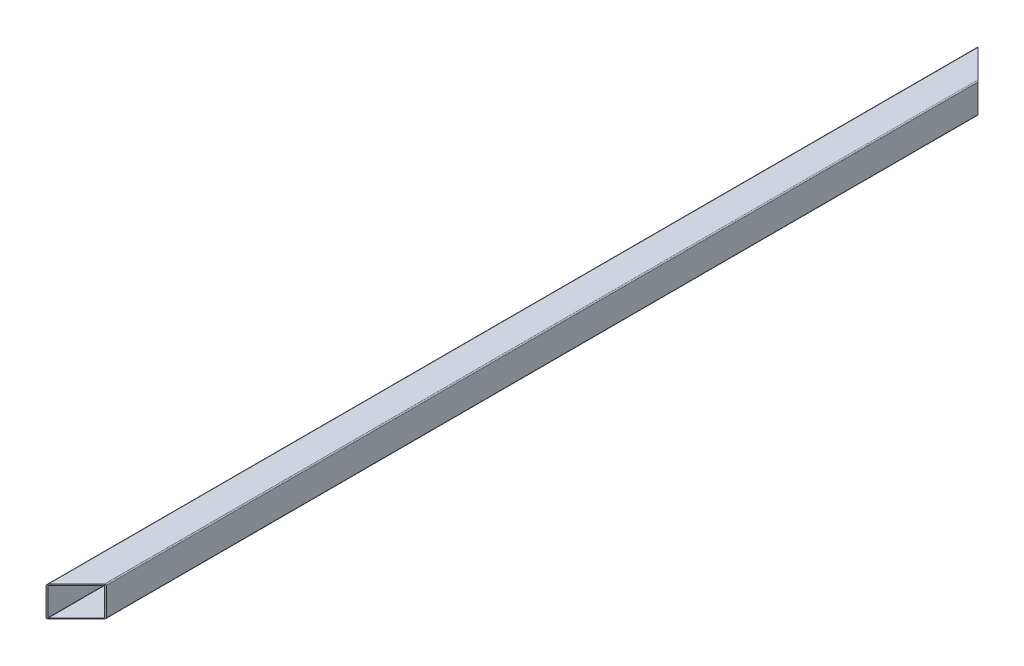
ISO-10303-21;
HEADER;
FILE_DESCRIPTION(('STEP AP214'),'2;1');
FILE_NAME('part.step','',(''),(''),'','','');
FILE_SCHEMA(('AUTOMOTIVE_DESIGN { 1 0 10303 214 1 1 1 1 }'));
ENDSEC;
DATA;
#1=APPLICATION_CONTEXT('core data for automotive mechanical design processes');
#2=APPLICATION_PROTOCOL_DEFINITION('international standard','automotive_design',2000,#1);
#3=PRODUCT_CONTEXT('',#1,'mechanical');
#4=PRODUCT('Part','Part','',(#3));
#5=PRODUCT_RELATED_PRODUCT_CATEGORY('part','',(#4));
#6=PRODUCT_DEFINITION_FORMATION('','',#4);
#7=PRODUCT_DEFINITION_CONTEXT('part definition',#1,'design');
#8=PRODUCT_DEFINITION('design','',#6,#7);
#9=PRODUCT_DEFINITION_SHAPE('','',#8);
#10=(LENGTH_UNIT() NAMED_UNIT(*) SI_UNIT(.MILLI.,.METRE.));
#11=(NAMED_UNIT(*) PLANE_ANGLE_UNIT() SI_UNIT($,.RADIAN.));
#12=(NAMED_UNIT(*) SI_UNIT($,.STERADIAN.) SOLID_ANGLE_UNIT());
#13=UNCERTAINTY_MEASURE_WITH_UNIT(LENGTH_MEASURE(1.E-05),#10,'distance_accuracy_value','');
#14=(GEOMETRIC_REPRESENTATION_CONTEXT(3) GLOBAL_UNCERTAINTY_ASSIGNED_CONTEXT((#13)) GLOBAL_UNIT_ASSIGNED_CONTEXT((#10,
#11,#12)) REPRESENTATION_CONTEXT('',''));
#15=CARTESIAN_POINT('',(0.,0.,0.));
#16=DIRECTION('',(0.,0.,1.));
#17=DIRECTION('',(1.,0.,0.));
#18=AXIS2_PLACEMENT_3D('',#15,#16,#17);
#19=CARTESIAN_POINT('',(-18.5,18.5,-1236.));
#20=DIRECTION('',(0.,0.,1.));
#21=DIRECTION('',(1.,0.,0.));
#22=AXIS2_PLACEMENT_3D('',#19,#20,#21);
#23=CYLINDRICAL_SURFACE('',#22,1.5);
#24=DIRECTION('',(0.,0.,1.));
#25=VECTOR('',#24,1.);
#26=CARTESIAN_POINT('',(-20.,18.5,-1236.));
#27=LINE('',#26,#25);
#28=CARTESIAN_POINT('',(-20.,18.5,-1236.));
#29=VERTEX_POINT('',#28);
#30=CARTESIAN_POINT('',(-20.,18.5,0.));
#31=VERTEX_POINT('',#30);
#32=EDGE_CURVE('E227',#29,#31,#27,.T.);
#33=ORIENTED_EDGE('',*,*,#32,.T.);
#34=CARTESIAN_POINT('',(-18.5,18.5,-1.50000000000006));
#35=DIRECTION('',(-0.707106781186549,0.,-0.707106781186546));
#36=DIRECTION('',(-0.707106781186546,0.,0.707106781186549));
#37=AXIS2_PLACEMENT_3D('',#34,#35,#36);
#38=ELLIPSE('',#37,2.12132034355964,1.5);
#39=CARTESIAN_POINT('',(-18.5,20.,-1.5));
#40=VERTEX_POINT('',#39);
#41=EDGE_CURVE('E184',#31,#40,#38,.T.);
#42=ORIENTED_EDGE('',*,*,#41,.T.);
#43=DIRECTION('',(0.,0.,1.));
#44=VECTOR('',#43,1.);
#45=CARTESIAN_POINT('',(-18.5,20.,-1236.));
#46=LINE('',#45,#44);
#47=CARTESIAN_POINT('',(-18.5,20.,-1234.5));
#48=VERTEX_POINT('',#47);
#49=EDGE_CURVE('E12',#48,#40,#46,.T.);
#50=ORIENTED_EDGE('',*,*,#49,.F.);
#51=CARTESIAN_POINT('',(-18.5,18.5,-1234.5));
#52=DIRECTION('',(-0.707106781186549,0.,0.707106781186546));
#53=DIRECTION('',(0.707106781186546,0.,0.707106781186549));
#54=AXIS2_PLACEMENT_3D('',#51,#52,#53);
#55=ELLIPSE('',#54,2.12132034355964,1.5);
#56=EDGE_CURVE('E294',#48,#29,#55,.T.);
#57=ORIENTED_EDGE('',*,*,#56,.T.);
#58=EDGE_LOOP('',(#33,#42,#50,#57));
#59=FACE_BOUND('',#58,.T.);
#60=ADVANCED_FACE('F59',(#59),#23,.T.);
#61=CARTESIAN_POINT('',(-18.5,20.,-1236.));
#62=DIRECTION('',(0.,-1.,0.));
#63=DIRECTION('',(0.,0.,-1.));
#64=AXIS2_PLACEMENT_3D('',#61,#62,#63);
#65=PLANE('',#64);
#66=ORIENTED_EDGE('',*,*,#49,.T.);
#67=DIRECTION('',(-0.707106781186546,0.,0.707106781186549));
#68=VECTOR('',#67,1.);
#69=CARTESIAN_POINT('',(-20.,20.,0.));
#70=LINE('',#69,#68);
#71=CARTESIAN_POINT('',(18.5,20.,-38.5000000000002));
#72=VERTEX_POINT('',#71);
#73=EDGE_CURVE('E176',#72,#40,#70,.T.);
#74=ORIENTED_EDGE('',*,*,#73,.F.);
#75=DIRECTION('',(0.,0.,1.));
#76=VECTOR('',#75,1.);
#77=CARTESIAN_POINT('',(18.5,20.,-1236.));
#78=LINE('',#77,#76);
#79=CARTESIAN_POINT('',(18.5,20.,-1197.5));
#80=VERTEX_POINT('',#79);
#81=EDGE_CURVE('E68',#80,#72,#78,.T.);
#82=ORIENTED_EDGE('',*,*,#81,.F.);
#83=DIRECTION('',(0.707106781186546,0.,0.707106781186549));
#84=VECTOR('',#83,1.);
#85=CARTESIAN_POINT('',(-20.,20.,-1236.));
#86=LINE('',#85,#84);
#87=EDGE_CURVE('E268',#48,#80,#86,.T.);
#88=ORIENTED_EDGE('',*,*,#87,.F.);
#89=EDGE_LOOP('',(#66,#74,#82,#88));
#90=FACE_BOUND('',#89,.T.);
#91=ADVANCED_FACE('F188',(#90),#65,.F.);
#92=CARTESIAN_POINT('',(18.5,18.5,-1236.));
#93=DIRECTION('',(0.,0.,1.));
#94=DIRECTION('',(1.,0.,0.));
#95=AXIS2_PLACEMENT_3D('',#92,#93,#94);
#96=CYLINDRICAL_SURFACE('',#95,1.5);
#97=ORIENTED_EDGE('',*,*,#81,.T.);
#98=CARTESIAN_POINT('',(18.5,18.5,-38.5000000000002));
#99=DIRECTION('',(-0.707106781186549,0.,-0.707106781186546));
#100=DIRECTION('',(-0.707106781186546,0.,0.707106781186549));
#101=AXIS2_PLACEMENT_3D('',#98,#99,#100);
#102=ELLIPSE('',#101,2.12132034355964,1.5);
#103=CARTESIAN_POINT('',(20.,18.5,-40.0000000000003));
#104=VERTEX_POINT('',#103);
#105=EDGE_CURVE('E173',#72,#104,#102,.T.);
#106=ORIENTED_EDGE('',*,*,#105,.T.);
#107=DIRECTION('',(0.,0.,1.));
#108=VECTOR('',#107,1.);
#109=CARTESIAN_POINT('',(20.,18.5,-1236.));
#110=LINE('',#109,#108);
#111=CARTESIAN_POINT('',(20.,18.5,-1196.));
#112=VERTEX_POINT('',#111);
#113=EDGE_CURVE('E196',#112,#104,#110,.T.);
#114=ORIENTED_EDGE('',*,*,#113,.F.);
#115=CARTESIAN_POINT('',(18.5,18.5,-1197.5));
#116=DIRECTION('',(-0.707106781186549,0.,0.707106781186546));
#117=DIRECTION('',(0.707106781186546,0.,0.707106781186549));
#118=AXIS2_PLACEMENT_3D('',#115,#116,#117);
#119=ELLIPSE('',#118,2.12132034355964,1.5);
#120=EDGE_CURVE('E195',#112,#80,#119,.T.);
#121=ORIENTED_EDGE('',*,*,#120,.T.);
#122=EDGE_LOOP('',(#97,#106,#114,#121));
#123=FACE_BOUND('',#122,.T.);
#124=ADVANCED_FACE('F194',(#123),#96,.T.);
#125=CARTESIAN_POINT('',(20.,-18.5,-1236.));
#126=DIRECTION('',(-1.,0.,0.));
#127=DIRECTION('',(0.,0.,1.));
#128=AXIS2_PLACEMENT_3D('',#125,#126,#127);
#129=PLANE('',#128);
#130=ORIENTED_EDGE('',*,*,#113,.T.);
#131=DIRECTION('',(0.,-1.,0.));
#132=VECTOR('',#131,1.);
#133=CARTESIAN_POINT('',(20.,-18.5,-40.0000000000003));
#134=LINE('',#133,#132);
#135=CARTESIAN_POINT('',(20.,-18.5,-40.0000000000003));
#136=VERTEX_POINT('',#135);
#137=EDGE_CURVE('E179',#104,#136,#134,.T.);
#138=ORIENTED_EDGE('',*,*,#137,.T.);
#139=DIRECTION('',(0.,0.,1.));
#140=VECTOR('',#139,1.);
#141=CARTESIAN_POINT('',(20.,-18.5,-1236.));
#142=LINE('',#141,#140);
#143=CARTESIAN_POINT('',(20.,-18.5,-1196.));
#144=VERTEX_POINT('',#143);
#145=EDGE_CURVE('E198',#144,#136,#142,.T.);
#146=ORIENTED_EDGE('',*,*,#145,.F.);
#147=DIRECTION('',(0.,1.,0.));
#148=VECTOR('',#147,1.);
#149=CARTESIAN_POINT('',(20.,-18.5,-1196.));
#150=LINE('',#149,#148);
#151=EDGE_CURVE('E261',#144,#112,#150,.T.);
#152=ORIENTED_EDGE('',*,*,#151,.T.);
#153=EDGE_LOOP('',(#130,#138,#146,#152));
#154=FACE_BOUND('',#153,.T.);
#155=ADVANCED_FACE('F260',(#154),#129,.F.);
#156=CARTESIAN_POINT('',(18.5,-18.5,-1236.));
#157=DIRECTION('',(0.,0.,1.));
#158=DIRECTION('',(1.,0.,0.));
#159=AXIS2_PLACEMENT_3D('',#156,#157,#158);
#160=CYLINDRICAL_SURFACE('',#159,1.5);
#161=ORIENTED_EDGE('',*,*,#145,.T.);
#162=CARTESIAN_POINT('',(18.5,-18.5,-38.5000000000002));
#163=DIRECTION('',(-0.707106781186549,0.,-0.707106781186546));
#164=DIRECTION('',(-0.707106781186546,0.,0.707106781186549));
#165=AXIS2_PLACEMENT_3D('',#162,#163,#164);
#166=ELLIPSE('',#165,2.12132034355965,1.5);
#167=CARTESIAN_POINT('',(18.5000000000001,-20.,-38.5000000000003));
#168=VERTEX_POINT('',#167);
#169=EDGE_CURVE('E256',#136,#168,#166,.T.);
#170=ORIENTED_EDGE('',*,*,#169,.T.);
#171=DIRECTION('',(0.,0.,1.));
#172=VECTOR('',#171,1.);
#173=CARTESIAN_POINT('',(18.5,-20.,-1236.));
#174=LINE('',#173,#172);
#175=CARTESIAN_POINT('',(18.5,-20.,-1197.5));
#176=VERTEX_POINT('',#175);
#177=EDGE_CURVE('E247',#176,#168,#174,.T.);
#178=ORIENTED_EDGE('',*,*,#177,.F.);
#179=CARTESIAN_POINT('',(18.5,-18.5,-1197.5));
#180=DIRECTION('',(-0.707106781186549,0.,0.707106781186546));
#181=DIRECTION('',(0.707106781186546,0.,0.707106781186549));
#182=AXIS2_PLACEMENT_3D('',#179,#180,#181);
#183=ELLIPSE('',#182,2.12132034355965,1.5);
#184=EDGE_CURVE('E257',#176,#144,#183,.T.);
#185=ORIENTED_EDGE('',*,*,#184,.T.);
#186=EDGE_LOOP('',(#161,#170,#178,#185));
#187=FACE_BOUND('',#186,.T.);
#188=ADVANCED_FACE('F254',(#187),#160,.T.);
#189=CARTESIAN_POINT('',(18.5,-20.,-1236.));
#190=DIRECTION('',(0.,1.,0.));
#191=DIRECTION('',(0.,0.,1.));
#192=AXIS2_PLACEMENT_3D('',#189,#190,#191);
#193=PLANE('',#192);
#194=ORIENTED_EDGE('',*,*,#177,.T.);
#195=DIRECTION('',(-0.707106781186546,0.,0.707106781186549));
#196=VECTOR('',#195,1.);
#197=CARTESIAN_POINT('',(617.25,-20.,-637.250000000003));
#198=LINE('',#197,#196);
#199=CARTESIAN_POINT('',(-18.5,-20.,-1.50000000000006));
#200=VERTEX_POINT('',#199);
#201=EDGE_CURVE('E263',#168,#200,#198,.T.);
#202=ORIENTED_EDGE('',*,*,#201,.T.);
#203=DIRECTION('',(0.,0.,1.));
#204=VECTOR('',#203,1.);
#205=CARTESIAN_POINT('',(-18.5,-20.,-1236.));
#206=LINE('',#205,#204);
#207=CARTESIAN_POINT('',(-18.5,-20.,-1234.5));
#208=VERTEX_POINT('',#207);
#209=EDGE_CURVE('E239',#208,#200,#206,.T.);
#210=ORIENTED_EDGE('',*,*,#209,.F.);
#211=DIRECTION('',(0.707106781186546,0.,0.707106781186549));
#212=VECTOR('',#211,1.);
#213=CARTESIAN_POINT('',(-0.750000000000098,-20.,-1216.75));
#214=LINE('',#213,#212);
#215=EDGE_CURVE('E288',#208,#176,#214,.T.);
#216=ORIENTED_EDGE('',*,*,#215,.T.);
#217=EDGE_LOOP('',(#194,#202,#210,#216));
#218=FACE_BOUND('',#217,.T.);
#219=ADVANCED_FACE('F341',(#218),#193,.F.);
#220=CARTESIAN_POINT('',(-18.5,-18.5,-1236.));
#221=DIRECTION('',(0.,0.,1.));
#222=DIRECTION('',(1.,0.,0.));
#223=AXIS2_PLACEMENT_3D('',#220,#221,#222);
#224=CYLINDRICAL_SURFACE('',#223,1.5);
#225=ORIENTED_EDGE('',*,*,#209,.T.);
#226=CARTESIAN_POINT('',(-18.5,-18.5,-1.50000000000006));
#227=DIRECTION('',(-0.707106781186549,0.,-0.707106781186546));
#228=DIRECTION('',(-0.707106781186546,0.,0.707106781186549));
#229=AXIS2_PLACEMENT_3D('',#226,#227,#228);
#230=ELLIPSE('',#229,2.12132034355965,1.5);
#231=CARTESIAN_POINT('',(-20.,-18.5,0.));
#232=VERTEX_POINT('',#231);
#233=EDGE_CURVE('E302',#200,#232,#230,.T.);
#234=ORIENTED_EDGE('',*,*,#233,.T.);
#235=DIRECTION('',(0.,0.,1.));
#236=VECTOR('',#235,1.);
#237=CARTESIAN_POINT('',(-20.,-18.5,-1236.));
#238=LINE('',#237,#236);
#239=CARTESIAN_POINT('',(-20.,-18.5,-1236.));
#240=VERTEX_POINT('',#239);
#241=EDGE_CURVE('E233',#240,#232,#238,.T.);
#242=ORIENTED_EDGE('',*,*,#241,.F.);
#243=CARTESIAN_POINT('',(-18.5,-18.5,-1234.5));
#244=DIRECTION('',(-0.707106781186549,0.,0.707106781186546));
#245=DIRECTION('',(0.707106781186546,0.,0.707106781186549));
#246=AXIS2_PLACEMENT_3D('',#243,#244,#245);
#247=ELLIPSE('',#246,2.12132034355965,1.5);
#248=EDGE_CURVE('E285',#240,#208,#247,.T.);
#249=ORIENTED_EDGE('',*,*,#248,.T.);
#250=EDGE_LOOP('',(#225,#234,#242,#249));
#251=FACE_BOUND('',#250,.T.);
#252=ADVANCED_FACE('F305',(#251),#224,.T.);
#253=CARTESIAN_POINT('',(18.5,18.5,-1236.));
#254=DIRECTION('',(0.,0.,1.));
#255=DIRECTION('',(1.,0.,0.));
#256=AXIS2_PLACEMENT_3D('',#253,#254,#255);
#257=CYLINDRICAL_SURFACE('',#256,0.3);
#258=CARTESIAN_POINT('',(18.5,18.5,-38.5000000000002));
#259=DIRECTION('',(-0.707106781186549,0.,-0.707106781186546));
#260=DIRECTION('',(-0.707106781186546,0.,0.707106781186549));
#261=AXIS2_PLACEMENT_3D('',#258,#259,#260);
#262=ELLIPSE('',#261,0.42426406871193,0.3);
#263=CARTESIAN_POINT('',(18.5000000000001,18.8,-38.5000000000003));
#264=VERTEX_POINT('',#263);
#265=CARTESIAN_POINT('',(18.8,18.5,-38.8000000000004));
#266=VERTEX_POINT('',#265);
#267=EDGE_CURVE('E76',#264,#266,#262,.T.);
#268=ORIENTED_EDGE('',*,*,#267,.F.);
#269=DIRECTION('',(0.,0.,1.));
#270=VECTOR('',#269,1.);
#271=CARTESIAN_POINT('',(18.5,18.8,-1236.));
#272=LINE('',#271,#270);
#273=CARTESIAN_POINT('',(18.5,18.8,-1197.5));
#274=VERTEX_POINT('',#273);
#275=EDGE_CURVE('E63',#274,#264,#272,.T.);
#276=ORIENTED_EDGE('',*,*,#275,.F.);
#277=CARTESIAN_POINT('',(18.5,18.5,-1197.5));
#278=DIRECTION('',(-0.707106781186549,0.,0.707106781186546));
#279=DIRECTION('',(0.707106781186546,0.,0.707106781186549));
#280=AXIS2_PLACEMENT_3D('',#277,#278,#279);
#281=ELLIPSE('',#280,0.42426406871193,0.3);
#282=CARTESIAN_POINT('',(18.8,18.5,-1197.2));
#283=VERTEX_POINT('',#282);
#284=EDGE_CURVE('E283',#283,#274,#281,.T.);
#285=ORIENTED_EDGE('',*,*,#284,.F.);
#286=DIRECTION('',(0.,0.,1.));
#287=VECTOR('',#286,1.);
#288=CARTESIAN_POINT('',(18.8,18.5,-1236.));
#289=LINE('',#288,#287);
#290=EDGE_CURVE('E202',#283,#266,#289,.T.);
#291=ORIENTED_EDGE('',*,*,#290,.T.);
#292=EDGE_LOOP('',(#268,#276,#285,#291));
#293=FACE_BOUND('',#292,.T.);
#294=ADVANCED_FACE('F61',(#293),#257,.F.);
#295=CARTESIAN_POINT('',(-18.5,18.8,-1236.));
#296=DIRECTION('',(0.,-1.,0.));
#297=DIRECTION('',(0.,0.,-1.));
#298=AXIS2_PLACEMENT_3D('',#295,#296,#297);
#299=PLANE('',#298);
#300=DIRECTION('',(0.707106781186546,0.,-0.707106781186549));
#301=VECTOR('',#300,1.);
#302=CARTESIAN_POINT('',(598.75,18.8,-618.750000000003));
#303=LINE('',#302,#301);
#304=CARTESIAN_POINT('',(-18.5,18.8,-1.50000000000006));
#305=VERTEX_POINT('',#304);
#306=EDGE_CURVE('E308',#305,#264,#303,.T.);
#307=ORIENTED_EDGE('',*,*,#306,.F.);
#308=DIRECTION('',(0.,0.,1.));
#309=VECTOR('',#308,1.);
#310=CARTESIAN_POINT('',(-18.5,18.8,-1236.));
#311=LINE('',#310,#309);
#312=CARTESIAN_POINT('',(-18.5,18.8,-1234.5));
#313=VERTEX_POINT('',#312);
#314=EDGE_CURVE('E220',#313,#305,#311,.T.);
#315=ORIENTED_EDGE('',*,*,#314,.F.);
#316=DIRECTION('',(-0.707106781186546,0.,-0.707106781186549));
#317=VECTOR('',#316,1.);
#318=CARTESIAN_POINT('',(-19.25,18.8,-1235.25));
#319=LINE('',#318,#317);
#320=EDGE_CURVE('E281',#274,#313,#319,.T.);
#321=ORIENTED_EDGE('',*,*,#320,.F.);
#322=ORIENTED_EDGE('',*,*,#275,.T.);
#323=EDGE_LOOP('',(#307,#315,#321,#322));
#324=FACE_BOUND('',#323,.T.);
#325=ADVANCED_FACE('F335',(#324),#299,.T.);
#326=CARTESIAN_POINT('',(-18.5,18.5,-1236.));
#327=DIRECTION('',(0.,0.,1.));
#328=DIRECTION('',(1.,0.,0.));
#329=AXIS2_PLACEMENT_3D('',#326,#327,#328);
#330=CYLINDRICAL_SURFACE('',#329,0.3);
#331=CARTESIAN_POINT('',(-18.5,18.5,-1.50000000000006));
#332=DIRECTION('',(-0.707106781186549,0.,-0.707106781186546));
#333=DIRECTION('',(-0.707106781186546,0.,0.707106781186549));
#334=AXIS2_PLACEMENT_3D('',#331,#332,#333);
#335=ELLIPSE('',#334,0.42426406871193,0.3);
#336=CARTESIAN_POINT('',(-18.8,18.5,-1.20000000000009));
#337=VERTEX_POINT('',#336);
#338=EDGE_CURVE('E312',#337,#305,#335,.T.);
#339=ORIENTED_EDGE('',*,*,#338,.F.);
#340=DIRECTION('',(0.,0.,1.));
#341=VECTOR('',#340,1.);
#342=CARTESIAN_POINT('',(-18.8,18.5,-1236.));
#343=LINE('',#342,#341);
#344=CARTESIAN_POINT('',(-18.8,18.5,-1234.8));
#345=VERTEX_POINT('',#344);
#346=EDGE_CURVE('E218',#345,#337,#343,.T.);
#347=ORIENTED_EDGE('',*,*,#346,.F.);
#348=CARTESIAN_POINT('',(-18.5,18.5,-1234.5));
#349=DIRECTION('',(-0.707106781186549,0.,0.707106781186546));
#350=DIRECTION('',(0.707106781186546,0.,0.707106781186549));
#351=AXIS2_PLACEMENT_3D('',#348,#349,#350);
#352=ELLIPSE('',#351,0.42426406871193,0.3);
#353=EDGE_CURVE('E279',#313,#345,#352,.T.);
#354=ORIENTED_EDGE('',*,*,#353,.F.);
#355=ORIENTED_EDGE('',*,*,#314,.T.);
#356=EDGE_LOOP('',(#339,#347,#354,#355));
#357=FACE_BOUND('',#356,.T.);
#358=ADVANCED_FACE('F340',(#357),#330,.F.);
#359=CARTESIAN_POINT('',(-18.8,18.5,-1236.));
#360=DIRECTION('',(1.,0.,0.));
#361=DIRECTION('',(0.,0.,-1.));
#362=AXIS2_PLACEMENT_3D('',#359,#360,#361);
#363=PLANE('',#362);
#364=DIRECTION('',(0.,1.,0.));
#365=VECTOR('',#364,1.);
#366=CARTESIAN_POINT('',(-18.8,18.5,-1.20000000000009));
#367=LINE('',#366,#365);
#368=CARTESIAN_POINT('',(-18.8,-18.5,-1.20000000000009));
#369=VERTEX_POINT('',#368);
#370=EDGE_CURVE('E314',#369,#337,#367,.T.);
#371=ORIENTED_EDGE('',*,*,#370,.F.);
#372=DIRECTION('',(0.,0.,1.));
#373=VECTOR('',#372,1.);
#374=CARTESIAN_POINT('',(-18.8,-18.5,-1236.));
#375=LINE('',#374,#373);
#376=CARTESIAN_POINT('',(-18.8,-18.5,-1234.8));
#377=VERTEX_POINT('',#376);
#378=EDGE_CURVE('E215',#377,#369,#375,.T.);
#379=ORIENTED_EDGE('',*,*,#378,.F.);
#380=DIRECTION('',(0.,-1.,0.));
#381=VECTOR('',#380,1.);
#382=CARTESIAN_POINT('',(-18.8,18.5,-1234.8));
#383=LINE('',#382,#381);
#384=EDGE_CURVE('E277',#345,#377,#383,.T.);
#385=ORIENTED_EDGE('',*,*,#384,.F.);
#386=ORIENTED_EDGE('',*,*,#346,.T.);
#387=EDGE_LOOP('',(#371,#379,#385,#386));
#388=FACE_BOUND('',#387,.T.);
#389=ADVANCED_FACE('F362',(#388),#363,.T.);
#390=CARTESIAN_POINT('',(-18.5,-18.5,-1236.));
#391=DIRECTION('',(0.,0.,1.));
#392=DIRECTION('',(1.,0.,0.));
#393=AXIS2_PLACEMENT_3D('',#390,#391,#392);
#394=CYLINDRICAL_SURFACE('',#393,0.300000000000005);
#395=CARTESIAN_POINT('',(-18.5,-18.5,-1.50000000000006));
#396=DIRECTION('',(-0.707106781186549,0.,-0.707106781186546));
#397=DIRECTION('',(-0.707106781186546,0.,0.707106781186549));
#398=AXIS2_PLACEMENT_3D('',#395,#396,#397);
#399=ELLIPSE('',#398,0.424264068711937,0.300000000000005);
#400=CARTESIAN_POINT('',(-18.5,-18.8,-1.50000000000006));
#401=VERTEX_POINT('',#400);
#402=EDGE_CURVE('E316',#401,#369,#399,.T.);
#403=ORIENTED_EDGE('',*,*,#402,.F.);
#404=DIRECTION('',(0.,0.,1.));
#405=VECTOR('',#404,1.);
#406=CARTESIAN_POINT('',(-18.5,-18.8,-1236.));
#407=LINE('',#406,#405);
#408=CARTESIAN_POINT('',(-18.5,-18.8,-1234.5));
#409=VERTEX_POINT('',#408);
#410=EDGE_CURVE('E212',#409,#401,#407,.T.);
#411=ORIENTED_EDGE('',*,*,#410,.F.);
#412=CARTESIAN_POINT('',(-18.5,-18.5,-1234.5));
#413=DIRECTION('',(-0.707106781186549,0.,0.707106781186546));
#414=DIRECTION('',(0.707106781186546,0.,0.707106781186549));
#415=AXIS2_PLACEMENT_3D('',#412,#413,#414);
#416=ELLIPSE('',#415,0.424264068711937,0.300000000000005);
#417=EDGE_CURVE('E275',#377,#409,#416,.T.);
#418=ORIENTED_EDGE('',*,*,#417,.F.);
#419=ORIENTED_EDGE('',*,*,#378,.T.);
#420=EDGE_LOOP('',(#403,#411,#418,#419));
#421=FACE_BOUND('',#420,.T.);
#422=ADVANCED_FACE('F358',(#421),#394,.F.);
#423=CARTESIAN_POINT('',(18.5,-18.8,-1236.));
#424=DIRECTION('',(0.,1.,0.));
#425=DIRECTION('',(0.,0.,1.));
#426=AXIS2_PLACEMENT_3D('',#423,#424,#425);
#427=PLANE('',#426);
#428=DIRECTION('',(-0.707106781186546,0.,0.707106781186549));
#429=VECTOR('',#428,1.);
#430=CARTESIAN_POINT('',(617.25,-18.8,-637.250000000003));
#431=LINE('',#430,#429);
#432=CARTESIAN_POINT('',(18.5,-18.8,-38.5000000000002));
#433=VERTEX_POINT('',#432);
#434=EDGE_CURVE('E318',#433,#401,#431,.T.);
#435=ORIENTED_EDGE('',*,*,#434,.F.);
#436=DIRECTION('',(0.,0.,1.));
#437=VECTOR('',#436,1.);
#438=CARTESIAN_POINT('',(18.5,-18.8,-1236.));
#439=LINE('',#438,#437);
#440=CARTESIAN_POINT('',(18.5,-18.8,-1197.5));
#441=VERTEX_POINT('',#440);
#442=EDGE_CURVE('E209',#441,#433,#439,.T.);
#443=ORIENTED_EDGE('',*,*,#442,.F.);
#444=DIRECTION('',(0.707106781186546,0.,0.707106781186549));
#445=VECTOR('',#444,1.);
#446=CARTESIAN_POINT('',(-0.750000000000098,-18.8,-1216.75));
#447=LINE('',#446,#445);
#448=EDGE_CURVE('E273',#409,#441,#447,.T.);
#449=ORIENTED_EDGE('',*,*,#448,.F.);
#450=ORIENTED_EDGE('',*,*,#410,.T.);
#451=EDGE_LOOP('',(#435,#443,#449,#450));
#452=FACE_BOUND('',#451,.T.);
#453=ADVANCED_FACE('F355',(#452),#427,.T.);
#454=CARTESIAN_POINT('',(18.5,-18.5,-1236.));
#455=DIRECTION('',(0.,0.,1.));
#456=DIRECTION('',(1.,0.,0.));
#457=AXIS2_PLACEMENT_3D('',#454,#455,#456);
#458=CYLINDRICAL_SURFACE('',#457,0.300000000000003);
#459=CARTESIAN_POINT('',(18.5,-18.5,-38.5000000000002));
#460=DIRECTION('',(-0.707106781186549,0.,-0.707106781186546));
#461=DIRECTION('',(-0.707106781186546,0.,0.707106781186549));
#462=AXIS2_PLACEMENT_3D('',#459,#460,#461);
#463=ELLIPSE('',#462,0.424264068711934,0.300000000000003);
#464=CARTESIAN_POINT('',(18.8,-18.5,-38.8000000000004));
#465=VERTEX_POINT('',#464);
#466=EDGE_CURVE('E320',#465,#433,#463,.T.);
#467=ORIENTED_EDGE('',*,*,#466,.F.);
#468=DIRECTION('',(0.,0.,1.));
#469=VECTOR('',#468,1.);
#470=CARTESIAN_POINT('',(18.8,-18.5,-1236.));
#471=LINE('',#470,#469);
#472=CARTESIAN_POINT('',(18.8,-18.5,-1197.2));
#473=VERTEX_POINT('',#472);
#474=EDGE_CURVE('E205',#473,#465,#471,.T.);
#475=ORIENTED_EDGE('',*,*,#474,.F.);
#476=CARTESIAN_POINT('',(18.5,-18.5,-1197.5));
#477=DIRECTION('',(-0.707106781186549,0.,0.707106781186546));
#478=DIRECTION('',(0.707106781186546,0.,0.707106781186549));
#479=AXIS2_PLACEMENT_3D('',#476,#477,#478);
#480=ELLIPSE('',#479,0.424264068711934,0.300000000000003);
#481=EDGE_CURVE('E84',#441,#473,#480,.T.);
#482=ORIENTED_EDGE('',*,*,#481,.F.);
#483=ORIENTED_EDGE('',*,*,#442,.T.);
#484=EDGE_LOOP('',(#467,#475,#482,#483));
#485=FACE_BOUND('',#484,.T.);
#486=ADVANCED_FACE('F328',(#485),#458,.F.);
#487=CARTESIAN_POINT('',(18.8,-18.5,-1236.));
#488=DIRECTION('',(-1.,0.,0.));
#489=DIRECTION('',(0.,0.,1.));
#490=AXIS2_PLACEMENT_3D('',#487,#488,#489);
#491=PLANE('',#490);
#492=DIRECTION('',(0.,-1.,0.));
#493=VECTOR('',#492,1.);
#494=CARTESIAN_POINT('',(18.8,-18.5,-38.8000000000004));
#495=LINE('',#494,#493);
#496=EDGE_CURVE('E191',#266,#465,#495,.T.);
#497=ORIENTED_EDGE('',*,*,#496,.F.);
#498=ORIENTED_EDGE('',*,*,#290,.F.);
#499=DIRECTION('',(0.,1.,0.));
#500=VECTOR('',#499,1.);
#501=CARTESIAN_POINT('',(18.8,-18.5,-1197.2));
#502=LINE('',#501,#500);
#503=EDGE_CURVE('E270',#473,#283,#502,.T.);
#504=ORIENTED_EDGE('',*,*,#503,.F.);
#505=ORIENTED_EDGE('',*,*,#474,.T.);
#506=EDGE_LOOP('',(#497,#498,#504,#505));
#507=FACE_BOUND('',#506,.T.);
#508=ADVANCED_FACE('F330',(#507),#491,.T.);
#509=CARTESIAN_POINT('',(-20.,18.5,-1236.));
#510=DIRECTION('',(1.,0.,0.));
#511=DIRECTION('',(0.,0.,-1.));
#512=AXIS2_PLACEMENT_3D('',#509,#510,#511);
#513=PLANE('',#512);
#514=DIRECTION('',(0.,1.,0.));
#515=VECTOR('',#514,1.);
#516=CARTESIAN_POINT('',(-20.,18.5,0.));
#517=LINE('',#516,#515);
#518=EDGE_CURVE('E242',#232,#31,#517,.T.);
#519=ORIENTED_EDGE('',*,*,#518,.T.);
#520=ORIENTED_EDGE('',*,*,#32,.F.);
#521=DIRECTION('',(0.,1.,0.));
#522=VECTOR('',#521,1.);
#523=CARTESIAN_POINT('',(-20.,18.5,-1236.));
#524=LINE('',#523,#522);
#525=EDGE_CURVE('E206',#240,#29,#524,.T.);
#526=ORIENTED_EDGE('',*,*,#525,.F.);
#527=ORIENTED_EDGE('',*,*,#241,.T.);
#528=EDGE_LOOP('',(#519,#520,#526,#527));
#529=FACE_BOUND('',#528,.T.);
#530=ADVANCED_FACE('F299',(#529),#513,.F.);
#531=CARTESIAN_POINT('',(-20.,-30.,-1236.));
#532=DIRECTION('',(-0.707106781186549,0.,0.707106781186546));
#533=DIRECTION('',(0.707106781186546,0.,0.707106781186549));
#534=AXIS2_PLACEMENT_3D('',#531,#532,#533);
#535=PLANE('',#534);
#536=ORIENTED_EDGE('',*,*,#284,.T.);
#537=ORIENTED_EDGE('',*,*,#320,.T.);
#538=ORIENTED_EDGE('',*,*,#353,.T.);
#539=ORIENTED_EDGE('',*,*,#384,.T.);
#540=ORIENTED_EDGE('',*,*,#417,.T.);
#541=ORIENTED_EDGE('',*,*,#448,.T.);
#542=ORIENTED_EDGE('',*,*,#481,.T.);
#543=ORIENTED_EDGE('',*,*,#503,.T.);
#544=EDGE_LOOP('',(#536,#537,#538,#539,#540,#541,#542,#543));
#545=FACE_BOUND('',#544,.T.);
#546=ORIENTED_EDGE('',*,*,#87,.T.);
#547=ORIENTED_EDGE('',*,*,#120,.F.);
#548=ORIENTED_EDGE('',*,*,#151,.F.);
#549=ORIENTED_EDGE('',*,*,#184,.F.);
#550=ORIENTED_EDGE('',*,*,#215,.F.);
#551=ORIENTED_EDGE('',*,*,#248,.F.);
#552=ORIENTED_EDGE('',*,*,#525,.T.);
#553=ORIENTED_EDGE('',*,*,#56,.F.);
#554=EDGE_LOOP('',(#546,#547,#548,#549,#550,#551,#552,#553));
#555=FACE_BOUND('',#554,.T.);
#556=ADVANCED_FACE('F332',(#545,#555),#535,.F.);
#557=CARTESIAN_POINT('',(-20.,-30.,0.));
#558=DIRECTION('',(-0.707106781186549,0.,-0.707106781186546));
#559=DIRECTION('',(-0.707106781186546,0.,0.707106781186549));
#560=AXIS2_PLACEMENT_3D('',#557,#558,#559);
#561=PLANE('',#560);
#562=ORIENTED_EDGE('',*,*,#267,.T.);
#563=ORIENTED_EDGE('',*,*,#496,.T.);
#564=ORIENTED_EDGE('',*,*,#466,.T.);
#565=ORIENTED_EDGE('',*,*,#434,.T.);
#566=ORIENTED_EDGE('',*,*,#402,.T.);
#567=ORIENTED_EDGE('',*,*,#370,.T.);
#568=ORIENTED_EDGE('',*,*,#338,.T.);
#569=ORIENTED_EDGE('',*,*,#306,.T.);
#570=EDGE_LOOP('',(#562,#563,#564,#565,#566,#567,#568,#569));
#571=FACE_BOUND('',#570,.T.);
#572=ORIENTED_EDGE('',*,*,#518,.F.);
#573=ORIENTED_EDGE('',*,*,#233,.F.);
#574=ORIENTED_EDGE('',*,*,#201,.F.);
#575=ORIENTED_EDGE('',*,*,#169,.F.);
#576=ORIENTED_EDGE('',*,*,#137,.F.);
#577=ORIENTED_EDGE('',*,*,#105,.F.);
#578=ORIENTED_EDGE('',*,*,#73,.T.);
#579=ORIENTED_EDGE('',*,*,#41,.F.);
#580=EDGE_LOOP('',(#572,#573,#574,#575,#576,#577,#578,#579));
#581=FACE_BOUND('',#580,.T.);
#582=ADVANCED_FACE('F175',(#571,#581),#561,.F.);
#583=CLOSED_SHELL('',(#60,#91,#124,#155,#188,#219,#252,#294,#325,#358,#389,#422,#453,#486,#508,
#530,#556,#582));
#584=MANIFOLD_SOLID_BREP('B2',#583);
#585=ADVANCED_BREP_SHAPE_REPRESENTATION('',(#18,#584),#14);
#586=SHAPE_DEFINITION_REPRESENTATION(#9,#585);
ENDSEC;
END-ISO-10303-21;
